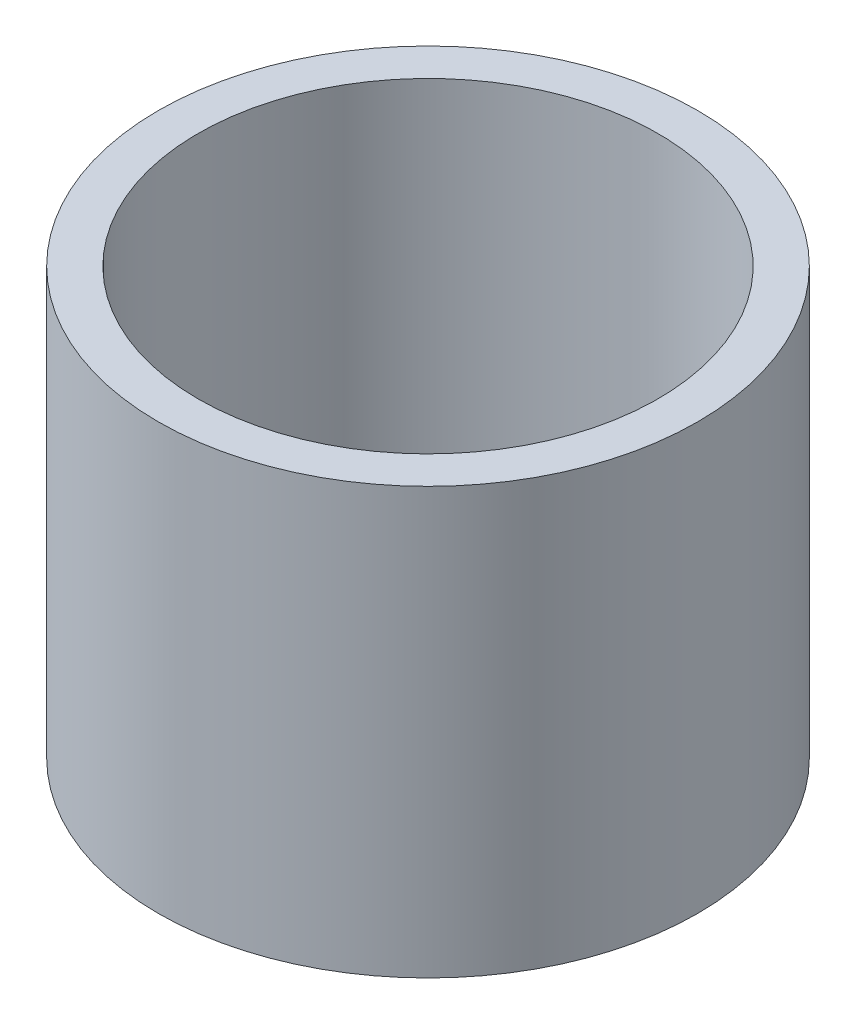
ISO-10303-21;
HEADER;
FILE_DESCRIPTION(('STEP AP214'),'2;1');
FILE_NAME('part.step','',(''),(''),'','','');
FILE_SCHEMA(('AUTOMOTIVE_DESIGN { 1 0 10303 214 1 1 1 1 }'));
ENDSEC;
DATA;
#1=APPLICATION_CONTEXT('core data for automotive mechanical design processes');
#2=APPLICATION_PROTOCOL_DEFINITION('international standard','automotive_design',2000,#1);
#3=PRODUCT_CONTEXT('',#1,'mechanical');
#4=PRODUCT('Part','Part','',(#3));
#5=PRODUCT_RELATED_PRODUCT_CATEGORY('part','',(#4));
#6=PRODUCT_DEFINITION_FORMATION('','',#4);
#7=PRODUCT_DEFINITION_CONTEXT('part definition',#1,'design');
#8=PRODUCT_DEFINITION('design','',#6,#7);
#9=PRODUCT_DEFINITION_SHAPE('','',#8);
#10=(LENGTH_UNIT() NAMED_UNIT(*) SI_UNIT(.MILLI.,.METRE.));
#11=(NAMED_UNIT(*) PLANE_ANGLE_UNIT() SI_UNIT($,.RADIAN.));
#12=(NAMED_UNIT(*) SI_UNIT($,.STERADIAN.) SOLID_ANGLE_UNIT());
#13=UNCERTAINTY_MEASURE_WITH_UNIT(LENGTH_MEASURE(1.E-05),#10,'distance_accuracy_value','');
#14=(GEOMETRIC_REPRESENTATION_CONTEXT(3) GLOBAL_UNCERTAINTY_ASSIGNED_CONTEXT((#13)) GLOBAL_UNIT_ASSIGNED_CONTEXT((#10,
#11,#12)) REPRESENTATION_CONTEXT('',''));
#15=CARTESIAN_POINT('',(0.,0.,0.));
#16=DIRECTION('',(0.,0.,1.));
#17=DIRECTION('',(1.,0.,0.));
#18=AXIS2_PLACEMENT_3D('',#15,#16,#17);
#19=CARTESIAN_POINT('',(0.,15.,0.));
#20=DIRECTION('',(0.,1.,0.));
#21=DIRECTION('',(0.,0.,1.));
#22=AXIS2_PLACEMENT_3D('',#19,#20,#21);
#23=PLANE('',#22);
#24=CARTESIAN_POINT('',(0.,15.,0.));
#25=DIRECTION('',(0.,1.,0.));
#26=DIRECTION('',(0.,0.,1.));
#27=AXIS2_PLACEMENT_3D('',#24,#25,#26);
#28=CIRCLE('',#27,9.5);
#29=CARTESIAN_POINT('',(0.,15.,9.5));
#30=VERTEX_POINT('',#29);
#31=EDGE_CURVE('E10',#30,#30,#28,.T.);
#32=ORIENTED_EDGE('',*,*,#31,.T.);
#33=EDGE_LOOP('',(#32));
#34=FACE_BOUND('',#33,.T.);
#35=CARTESIAN_POINT('',(0.,15.,0.));
#36=DIRECTION('',(0.,1.,0.));
#37=DIRECTION('',(0.,0.,1.));
#38=AXIS2_PLACEMENT_3D('',#35,#36,#37);
#39=CIRCLE('',#38,8.1);
#40=CARTESIAN_POINT('',(0.,15.,8.1));
#41=VERTEX_POINT('',#40);
#42=EDGE_CURVE('E43',#41,#41,#39,.T.);
#43=ORIENTED_EDGE('',*,*,#42,.F.);
#44=EDGE_LOOP('',(#43));
#45=FACE_BOUND('',#44,.T.);
#46=ADVANCED_FACE('F32',(#34,#45),#23,.T.);
#47=CARTESIAN_POINT('',(0.,0.,0.));
#48=DIRECTION('',(0.,1.,0.));
#49=DIRECTION('',(0.,0.,1.));
#50=AXIS2_PLACEMENT_3D('',#47,#48,#49);
#51=PLANE('',#50);
#52=CARTESIAN_POINT('',(0.,0.,0.));
#53=DIRECTION('',(0.,1.,0.));
#54=DIRECTION('',(0.,0.,1.));
#55=AXIS2_PLACEMENT_3D('',#52,#53,#54);
#56=CIRCLE('',#55,9.5);
#57=CARTESIAN_POINT('',(0.,0.,9.5));
#58=VERTEX_POINT('',#57);
#59=EDGE_CURVE('E36',#58,#58,#56,.T.);
#60=ORIENTED_EDGE('',*,*,#59,.F.);
#61=EDGE_LOOP('',(#60));
#62=FACE_BOUND('',#61,.T.);
#63=CARTESIAN_POINT('',(0.,0.,0.));
#64=DIRECTION('',(0.,1.,0.));
#65=DIRECTION('',(0.,0.,1.));
#66=AXIS2_PLACEMENT_3D('',#63,#64,#65);
#67=CIRCLE('',#66,8.1);
#68=CARTESIAN_POINT('',(0.,0.,8.1));
#69=VERTEX_POINT('',#68);
#70=EDGE_CURVE('E45',#69,#69,#67,.T.);
#71=ORIENTED_EDGE('',*,*,#70,.T.);
#72=EDGE_LOOP('',(#71));
#73=FACE_BOUND('',#72,.T.);
#74=ADVANCED_FACE('F55',(#62,#73),#51,.F.);
#75=CARTESIAN_POINT('',(0.,15.,0.));
#76=DIRECTION('',(0.,-1.,0.));
#77=DIRECTION('',(0.,0.,-1.));
#78=AXIS2_PLACEMENT_3D('',#75,#76,#77);
#79=CYLINDRICAL_SURFACE('',#78,9.5);
#80=ORIENTED_EDGE('',*,*,#31,.F.);
#81=EDGE_LOOP('',(#80));
#82=FACE_BOUND('',#81,.T.);
#83=ORIENTED_EDGE('',*,*,#59,.T.);
#84=EDGE_LOOP('',(#83));
#85=FACE_BOUND('',#84,.T.);
#86=ADVANCED_FACE('F34',(#82,#85),#79,.T.);
#87=CARTESIAN_POINT('',(0.,15.,0.));
#88=DIRECTION('',(0.,-1.,0.));
#89=DIRECTION('',(0.,0.,-1.));
#90=AXIS2_PLACEMENT_3D('',#87,#88,#89);
#91=CYLINDRICAL_SURFACE('',#90,8.1);
#92=ORIENTED_EDGE('',*,*,#42,.T.);
#93=EDGE_LOOP('',(#92));
#94=FACE_BOUND('',#93,.T.);
#95=ORIENTED_EDGE('',*,*,#70,.F.);
#96=EDGE_LOOP('',(#95));
#97=FACE_BOUND('',#96,.T.);
#98=ADVANCED_FACE('F51',(#94,#97),#91,.F.);
#99=CLOSED_SHELL('',(#46,#74,#86,#98));
#100=MANIFOLD_SOLID_BREP('B2',#99);
#101=ADVANCED_BREP_SHAPE_REPRESENTATION('',(#18,#100),#14);
#102=SHAPE_DEFINITION_REPRESENTATION(#9,#101);
ENDSEC;
END-ISO-10303-21;
